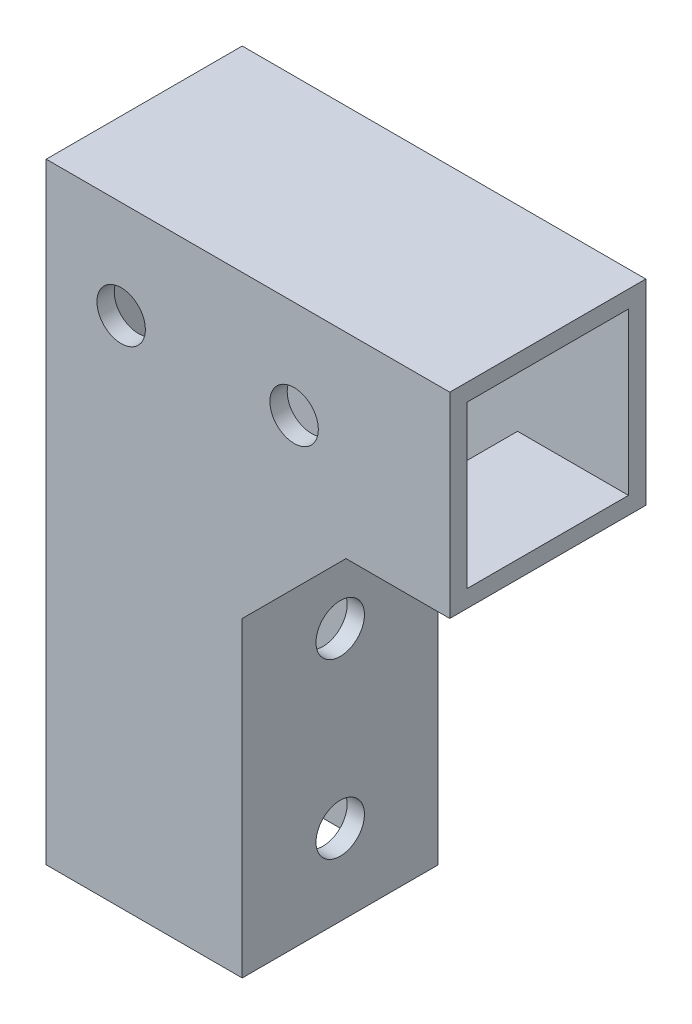
ISO-10303-21;
HEADER;
FILE_DESCRIPTION(('STEP AP214'),'2;1');
FILE_NAME('part.step','',(''),(''),'','','');
FILE_SCHEMA(('AUTOMOTIVE_DESIGN { 1 0 10303 214 1 1 1 1 }'));
ENDSEC;
DATA;
#1=APPLICATION_CONTEXT('core data for automotive mechanical design processes');
#2=APPLICATION_PROTOCOL_DEFINITION('international standard','automotive_design',2000,#1);
#3=PRODUCT_CONTEXT('',#1,'mechanical');
#4=PRODUCT('Part','Part','',(#3));
#5=PRODUCT_RELATED_PRODUCT_CATEGORY('part','',(#4));
#6=PRODUCT_DEFINITION_FORMATION('','',#4);
#7=PRODUCT_DEFINITION_CONTEXT('part definition',#1,'design');
#8=PRODUCT_DEFINITION('design','',#6,#7);
#9=PRODUCT_DEFINITION_SHAPE('','',#8);
#10=(LENGTH_UNIT() NAMED_UNIT(*) SI_UNIT(.MILLI.,.METRE.));
#11=(NAMED_UNIT(*) PLANE_ANGLE_UNIT() SI_UNIT($,.RADIAN.));
#12=(NAMED_UNIT(*) SI_UNIT($,.STERADIAN.) SOLID_ANGLE_UNIT());
#13=UNCERTAINTY_MEASURE_WITH_UNIT(LENGTH_MEASURE(1.E-05),#10,'distance_accuracy_value','');
#14=(GEOMETRIC_REPRESENTATION_CONTEXT(3) GLOBAL_UNCERTAINTY_ASSIGNED_CONTEXT((#13)) GLOBAL_UNIT_ASSIGNED_CONTEXT((#10,
#11,#12)) REPRESENTATION_CONTEXT('',''));
#15=CARTESIAN_POINT('',(0.,0.,0.));
#16=DIRECTION('',(0.,0.,1.));
#17=DIRECTION('',(1.,0.,0.));
#18=AXIS2_PLACEMENT_3D('',#15,#16,#17);
#19=CARTESIAN_POINT('',(-2.,49.,6.));
#20=DIRECTION('',(0.,1.,0.));
#21=DIRECTION('',(0.,0.,1.));
#22=AXIS2_PLACEMENT_3D('',#19,#20,#21);
#23=PLANE('',#22);
#24=DIRECTION('',(-1.,0.,0.));
#25=VECTOR('',#24,1.);
#26=CARTESIAN_POINT('',(-2.,49.,7.95));
#27=LINE('',#26,#25);
#28=CARTESIAN_POINT('',(-1.1,49.,7.95));
#29=VERTEX_POINT('',#28);
#30=CARTESIAN_POINT('',(-2.,49.,7.95));
#31=VERTEX_POINT('',#30);
#32=EDGE_CURVE('E226',#29,#31,#27,.T.);
#33=ORIENTED_EDGE('',*,*,#32,.F.);
#34=DIRECTION('',(0.,0.,1.));
#35=VECTOR('',#34,1.);
#36=CARTESIAN_POINT('',(-1.1,49.,6.9));
#37=LINE('',#36,#35);
#38=CARTESIAN_POINT('',(-1.1,49.,6.9));
#39=VERTEX_POINT('',#38);
#40=EDGE_CURVE('E520',#39,#29,#37,.T.);
#41=ORIENTED_EDGE('',*,*,#40,.F.);
#42=DIRECTION('',(-1.,0.,0.));
#43=VECTOR('',#42,1.);
#44=CARTESIAN_POINT('',(-1.1,49.,6.9));
#45=LINE('',#44,#43);
#46=CARTESIAN_POINT('',(0.,49.,6.9));
#47=VERTEX_POINT('',#46);
#48=EDGE_CURVE('E517',#47,#39,#45,.T.);
#49=ORIENTED_EDGE('',*,*,#48,.F.);
#50=DIRECTION('',(0.,0.,1.));
#51=VECTOR('',#50,1.);
#52=CARTESIAN_POINT('',(0.,49.,6.));
#53=LINE('',#52,#51);
#54=CARTESIAN_POINT('',(0.,49.,6.));
#55=VERTEX_POINT('',#54);
#56=EDGE_CURVE('E257',#55,#47,#53,.T.);
#57=ORIENTED_EDGE('',*,*,#56,.F.);
#58=DIRECTION('',(1.,0.,0.));
#59=VECTOR('',#58,1.);
#60=CARTESIAN_POINT('',(-2.,49.,6.));
#61=LINE('',#60,#59);
#62=CARTESIAN_POINT('',(-2.,49.,6.));
#63=VERTEX_POINT('',#62);
#64=EDGE_CURVE('E252',#63,#55,#61,.T.);
#65=ORIENTED_EDGE('',*,*,#64,.F.);
#66=DIRECTION('',(0.,0.,1.));
#67=VECTOR('',#66,1.);
#68=CARTESIAN_POINT('',(-2.,49.,6.));
#69=LINE('',#68,#67);
#70=EDGE_CURVE('E243',#63,#31,#69,.T.);
#71=ORIENTED_EDGE('',*,*,#70,.T.);
#72=EDGE_LOOP('',(#33,#41,#49,#57,#65,#71));
#73=FACE_BOUND('',#72,.T.);
#74=ADVANCED_FACE('F33',(#73),#23,.T.);
#75=CARTESIAN_POINT('',(15.5,51.5,15.5));
#76=DIRECTION('',(-1.,0.,0.));
#77=DIRECTION('',(0.,0.,1.));
#78=AXIS2_PLACEMENT_3D('',#75,#76,#77);
#79=PLANE('',#78);
#80=CARTESIAN_POINT('',(15.5,22.,8.5));
#81=DIRECTION('',(-1.,0.,0.));
#82=DIRECTION('',(0.,0.,1.));
#83=AXIS2_PLACEMENT_3D('',#80,#81,#82);
#84=CIRCLE('',#83,2.1);
#85=CARTESIAN_POINT('',(15.5,22.,10.6));
#86=VERTEX_POINT('',#85);
#87=EDGE_CURVE('E324',#86,#86,#84,.F.);
#88=ORIENTED_EDGE('',*,*,#87,.T.);
#89=EDGE_LOOP('',(#88));
#90=FACE_BOUND('',#89,.T.);
#91=CARTESIAN_POINT('',(15.5,7.,8.5));
#92=DIRECTION('',(-1.,0.,0.));
#93=DIRECTION('',(0.,0.,1.));
#94=AXIS2_PLACEMENT_3D('',#91,#92,#93);
#95=CIRCLE('',#94,2.1);
#96=CARTESIAN_POINT('',(15.5,7.,10.6));
#97=VERTEX_POINT('',#96);
#98=EDGE_CURVE('E317',#97,#97,#95,.F.);
#99=ORIENTED_EDGE('',*,*,#98,.T.);
#100=EDGE_LOOP('',(#99));
#101=FACE_BOUND('',#100,.T.);
#102=DIRECTION('',(0.,-1.,0.));
#103=VECTOR('',#102,1.);
#104=CARTESIAN_POINT('',(15.5,51.5,15.5));
#105=LINE('',#104,#103);
#106=CARTESIAN_POINT('',(15.5,27.6213203435596,15.5));
#107=VERTEX_POINT('',#106);
#108=CARTESIAN_POINT('',(15.5,0.,15.5));
#109=VERTEX_POINT('',#108);
#110=EDGE_CURVE('E363',#107,#109,#105,.T.);
#111=ORIENTED_EDGE('',*,*,#110,.F.);
#112=DIRECTION('',(0.,0.,-1.));
#113=VECTOR('',#112,1.);
#114=CARTESIAN_POINT('',(15.5,27.6213203435596,15.5));
#115=LINE('',#114,#113);
#116=CARTESIAN_POINT('',(15.5,27.6213203435596,1.5));
#117=VERTEX_POINT('',#116);
#118=EDGE_CURVE('E336',#107,#117,#115,.T.);
#119=ORIENTED_EDGE('',*,*,#118,.T.);
#120=DIRECTION('',(0.,-1.,0.));
#121=VECTOR('',#120,1.);
#122=CARTESIAN_POINT('',(15.5,51.5,1.5));
#123=LINE('',#122,#121);
#124=CARTESIAN_POINT('',(15.5,0.,1.5));
#125=VERTEX_POINT('',#124);
#126=EDGE_CURVE('E361',#117,#125,#123,.T.);
#127=ORIENTED_EDGE('',*,*,#126,.T.);
#128=DIRECTION('',(0.,0.,-1.));
#129=VECTOR('',#128,1.);
#130=CARTESIAN_POINT('',(15.5,0.,15.5));
#131=LINE('',#130,#129);
#132=EDGE_CURVE('E354',#109,#125,#131,.T.);
#133=ORIENTED_EDGE('',*,*,#132,.F.);
#134=EDGE_LOOP('',(#111,#119,#127,#133));
#135=FACE_BOUND('',#134,.T.);
#136=ADVANCED_FACE('F485',(#90,#101,#135),#79,.T.);
#137=CARTESIAN_POINT('',(0.,0.,17.));
#138=DIRECTION('',(0.,1.,0.));
#139=DIRECTION('',(0.,0.,1.));
#140=AXIS2_PLACEMENT_3D('',#137,#138,#139);
#141=PLANE('',#140);
#142=DIRECTION('',(1.,0.,0.));
#143=VECTOR('',#142,1.);
#144=CARTESIAN_POINT('',(0.,0.,0.));
#145=LINE('',#144,#143);
#146=CARTESIAN_POINT('',(0.,0.,0.));
#147=VERTEX_POINT('',#146);
#148=CARTESIAN_POINT('',(17.,0.,0.));
#149=VERTEX_POINT('',#148);
#150=EDGE_CURVE('E388',#147,#149,#145,.T.);
#151=ORIENTED_EDGE('',*,*,#150,.T.);
#152=DIRECTION('',(0.,0.,-1.));
#153=VECTOR('',#152,1.);
#154=CARTESIAN_POINT('',(17.,0.,17.));
#155=LINE('',#154,#153);
#156=CARTESIAN_POINT('',(17.,0.,17.));
#157=VERTEX_POINT('',#156);
#158=EDGE_CURVE('E42',#157,#149,#155,.T.);
#159=ORIENTED_EDGE('',*,*,#158,.F.);
#160=DIRECTION('',(1.,0.,0.));
#161=VECTOR('',#160,1.);
#162=CARTESIAN_POINT('',(0.,0.,17.));
#163=LINE('',#162,#161);
#164=CARTESIAN_POINT('',(0.,0.,17.));
#165=VERTEX_POINT('',#164);
#166=EDGE_CURVE('E372',#165,#157,#163,.T.);
#167=ORIENTED_EDGE('',*,*,#166,.F.);
#168=DIRECTION('',(0.,0.,-1.));
#169=VECTOR('',#168,1.);
#170=CARTESIAN_POINT('',(0.,0.,17.));
#171=LINE('',#170,#169);
#172=EDGE_CURVE('E11',#165,#147,#171,.T.);
#173=ORIENTED_EDGE('',*,*,#172,.T.);
#174=EDGE_LOOP('',(#151,#159,#167,#173));
#175=FACE_BOUND('',#174,.T.);
#176=DIRECTION('',(0.,0.,1.));
#177=VECTOR('',#176,1.);
#178=CARTESIAN_POINT('',(1.5,0.,15.5));
#179=LINE('',#178,#177);
#180=CARTESIAN_POINT('',(1.5,0.,1.5));
#181=VERTEX_POINT('',#180);
#182=CARTESIAN_POINT('',(1.5,0.,15.5));
#183=VERTEX_POINT('',#182);
#184=EDGE_CURVE('E339',#181,#183,#179,.T.);
#185=ORIENTED_EDGE('',*,*,#184,.T.);
#186=DIRECTION('',(1.,0.,0.));
#187=VECTOR('',#186,1.);
#188=CARTESIAN_POINT('',(1.5,0.,15.5));
#189=LINE('',#188,#187);
#190=EDGE_CURVE('E351',#183,#109,#189,.T.);
#191=ORIENTED_EDGE('',*,*,#190,.T.);
#192=ORIENTED_EDGE('',*,*,#132,.T.);
#193=DIRECTION('',(-1.,0.,0.));
#194=VECTOR('',#193,1.);
#195=CARTESIAN_POINT('',(1.5,0.,1.5));
#196=LINE('',#195,#194);
#197=EDGE_CURVE('E344',#125,#181,#196,.T.);
#198=ORIENTED_EDGE('',*,*,#197,.T.);
#199=EDGE_LOOP('',(#185,#191,#192,#198));
#200=FACE_BOUND('',#199,.T.);
#201=ADVANCED_FACE('F471',(#175,#200),#141,.F.);
#202=CARTESIAN_POINT('',(0.,0.,17.));
#203=DIRECTION('',(1.,0.,0.));
#204=DIRECTION('',(0.,0.,-1.));
#205=AXIS2_PLACEMENT_3D('',#202,#203,#204);
#206=PLANE('',#205);
#207=DIRECTION('',(0.,0.,-1.));
#208=VECTOR('',#207,1.);
#209=CARTESIAN_POINT('',(0.,33.,6.));
#210=LINE('',#209,#208);
#211=CARTESIAN_POINT('',(0.,33.,11.));
#212=VERTEX_POINT('',#211);
#213=CARTESIAN_POINT('',(0.,33.,6.));
#214=VERTEX_POINT('',#213);
#215=EDGE_CURVE('E242',#212,#214,#210,.T.);
#216=ORIENTED_EDGE('',*,*,#215,.T.);
#217=DIRECTION('',(0.,1.,0.));
#218=VECTOR('',#217,1.);
#219=CARTESIAN_POINT('',(0.,49.,6.));
#220=LINE('',#219,#218);
#221=EDGE_CURVE('E253',#214,#55,#220,.T.);
#222=ORIENTED_EDGE('',*,*,#221,.T.);
#223=ORIENTED_EDGE('',*,*,#56,.T.);
#224=DIRECTION('',(0.,1.,0.));
#225=VECTOR('',#224,1.);
#226=CARTESIAN_POINT('',(0.,34.,6.9));
#227=LINE('',#226,#225);
#228=CARTESIAN_POINT('',(0.,34.,6.9));
#229=VERTEX_POINT('',#228);
#230=EDGE_CURVE('E534',#229,#47,#227,.T.);
#231=ORIENTED_EDGE('',*,*,#230,.F.);
#232=DIRECTION('',(0.,0.,-1.));
#233=VECTOR('',#232,1.);
#234=CARTESIAN_POINT('',(0.,34.,6.9));
#235=LINE('',#234,#233);
#236=CARTESIAN_POINT('',(0.,34.,10.1));
#237=VERTEX_POINT('',#236);
#238=EDGE_CURVE('E548',#237,#229,#235,.T.);
#239=ORIENTED_EDGE('',*,*,#238,.F.);
#240=DIRECTION('',(0.,1.,0.));
#241=VECTOR('',#240,1.);
#242=CARTESIAN_POINT('',(0.,34.,10.1));
#243=LINE('',#242,#241);
#244=CARTESIAN_POINT('',(0.,49.,10.1));
#245=VERTEX_POINT('',#244);
#246=EDGE_CURVE('E536',#237,#245,#243,.T.);
#247=ORIENTED_EDGE('',*,*,#246,.T.);
#248=CARTESIAN_POINT('',(0.,49.,11.));
#249=VERTEX_POINT('',#248);
#250=EDGE_CURVE('E58',#245,#249,#53,.T.);
#251=ORIENTED_EDGE('',*,*,#250,.T.);
#252=DIRECTION('',(0.,-1.,0.));
#253=VECTOR('',#252,1.);
#254=CARTESIAN_POINT('',(0.,49.,11.));
#255=LINE('',#254,#253);
#256=EDGE_CURVE('E260',#249,#212,#255,.T.);
#257=ORIENTED_EDGE('',*,*,#256,.T.);
#258=EDGE_LOOP('',(#216,#222,#223,#231,#239,#247,#251,#257));
#259=FACE_BOUND('',#258,.T.);
#260=CARTESIAN_POINT('',(0.,22.,8.5));
#261=DIRECTION('',(1.,0.,0.));
#262=DIRECTION('',(0.,0.,-1.));
#263=AXIS2_PLACEMENT_3D('',#260,#261,#262);
#264=CIRCLE('',#263,2.1);
#265=CARTESIAN_POINT('',(0.,22.,6.4));
#266=VERTEX_POINT('',#265);
#267=EDGE_CURVE('E308',#266,#266,#264,.T.);
#268=ORIENTED_EDGE('',*,*,#267,.T.);
#269=EDGE_LOOP('',(#268));
#270=FACE_BOUND('',#269,.T.);
#271=CARTESIAN_POINT('',(0.,7.,8.5));
#272=DIRECTION('',(1.,0.,0.));
#273=DIRECTION('',(0.,0.,-1.));
#274=AXIS2_PLACEMENT_3D('',#271,#272,#273);
#275=CIRCLE('',#274,2.1);
#276=CARTESIAN_POINT('',(0.,7.,6.4));
#277=VERTEX_POINT('',#276);
#278=EDGE_CURVE('E305',#277,#277,#275,.T.);
#279=ORIENTED_EDGE('',*,*,#278,.T.);
#280=EDGE_LOOP('',(#279));
#281=FACE_BOUND('',#280,.T.);
#282=DIRECTION('',(0.,-1.,0.));
#283=VECTOR('',#282,1.);
#284=CARTESIAN_POINT('',(0.,0.,0.));
#285=LINE('',#284,#283);
#286=CARTESIAN_POINT('',(0.,53.,0.));
#287=VERTEX_POINT('',#286);
#288=EDGE_CURVE('E368',#287,#147,#285,.T.);
#289=ORIENTED_EDGE('',*,*,#288,.T.);
#290=ORIENTED_EDGE('',*,*,#172,.F.);
#291=DIRECTION('',(0.,-1.,0.));
#292=VECTOR('',#291,1.);
#293=CARTESIAN_POINT('',(0.,0.,17.));
#294=LINE('',#293,#292);
#295=CARTESIAN_POINT('',(0.,53.,17.));
#296=VERTEX_POINT('',#295);
#297=EDGE_CURVE('E369',#296,#165,#294,.T.);
#298=ORIENTED_EDGE('',*,*,#297,.F.);
#299=DIRECTION('',(0.,0.,-1.));
#300=VECTOR('',#299,1.);
#301=CARTESIAN_POINT('',(0.,53.,17.));
#302=LINE('',#301,#300);
#303=EDGE_CURVE('E385',#296,#287,#302,.T.);
#304=ORIENTED_EDGE('',*,*,#303,.T.);
#305=EDGE_LOOP('',(#289,#290,#298,#304));
#306=FACE_BOUND('',#305,.T.);
#307=ADVANCED_FACE('F35',(#259,#270,#281,#306),#206,.F.);
#308=CARTESIAN_POINT('',(17.,27.,17.));
#309=DIRECTION('',(-1.,0.,0.));
#310=DIRECTION('',(0.,-1.,0.));
#311=AXIS2_PLACEMENT_3D('',#308,#309,#310);
#312=PLANE('',#311);
#313=CARTESIAN_POINT('',(17.,22.,8.5));
#314=DIRECTION('',(-1.,0.,0.));
#315=DIRECTION('',(0.,-1.,0.));
#316=AXIS2_PLACEMENT_3D('',#313,#314,#315);
#317=CIRCLE('',#316,2.1);
#318=CARTESIAN_POINT('',(17.,19.9,8.5));
#319=VERTEX_POINT('',#318);
#320=EDGE_CURVE('E321',#319,#319,#317,.F.);
#321=ORIENTED_EDGE('',*,*,#320,.F.);
#322=EDGE_LOOP('',(#321));
#323=FACE_BOUND('',#322,.T.);
#324=CARTESIAN_POINT('',(17.,7.,8.5));
#325=DIRECTION('',(-1.,0.,0.));
#326=DIRECTION('',(0.,-1.,0.));
#327=AXIS2_PLACEMENT_3D('',#324,#325,#326);
#328=CIRCLE('',#327,2.1);
#329=CARTESIAN_POINT('',(17.,4.9,8.5));
#330=VERTEX_POINT('',#329);
#331=EDGE_CURVE('E314',#330,#330,#328,.F.);
#332=ORIENTED_EDGE('',*,*,#331,.F.);
#333=EDGE_LOOP('',(#332));
#334=FACE_BOUND('',#333,.T.);
#335=DIRECTION('',(0.,1.,0.));
#336=VECTOR('',#335,1.);
#337=CARTESIAN_POINT('',(17.,27.,0.));
#338=LINE('',#337,#336);
#339=CARTESIAN_POINT('',(17.,27.,0.));
#340=VERTEX_POINT('',#339);
#341=EDGE_CURVE('E390',#149,#340,#338,.T.);
#342=ORIENTED_EDGE('',*,*,#341,.T.);
#343=DIRECTION('',(0.,0.,-1.));
#344=VECTOR('',#343,1.);
#345=CARTESIAN_POINT('',(17.,27.,17.));
#346=LINE('',#345,#344);
#347=CARTESIAN_POINT('',(17.,27.,17.));
#348=VERTEX_POINT('',#347);
#349=EDGE_CURVE('E410',#348,#340,#346,.T.);
#350=ORIENTED_EDGE('',*,*,#349,.F.);
#351=DIRECTION('',(0.,1.,0.));
#352=VECTOR('',#351,1.);
#353=CARTESIAN_POINT('',(17.,27.,17.));
#354=LINE('',#353,#352);
#355=EDGE_CURVE('E375',#157,#348,#354,.T.);
#356=ORIENTED_EDGE('',*,*,#355,.F.);
#357=ORIENTED_EDGE('',*,*,#158,.T.);
#358=EDGE_LOOP('',(#342,#350,#356,#357));
#359=FACE_BOUND('',#358,.T.);
#360=ADVANCED_FACE('F468',(#323,#334,#359),#312,.F.);
#361=CARTESIAN_POINT('',(17.,27.,17.));
#362=DIRECTION('',(-0.707106781186548,0.707106781186548,0.));
#363=DIRECTION('',(-0.707106781186548,-0.707106781186548,0.));
#364=AXIS2_PLACEMENT_3D('',#361,#362,#363);
#365=PLANE('',#364);
#366=DIRECTION('',(0.707106781186547,0.707106781186547,0.));
#367=VECTOR('',#366,1.);
#368=CARTESIAN_POINT('',(17.,27.,0.));
#369=LINE('',#368,#367);
#370=CARTESIAN_POINT('',(26.,36.,0.));
#371=VERTEX_POINT('',#370);
#372=EDGE_CURVE('E392',#340,#371,#369,.T.);
#373=ORIENTED_EDGE('',*,*,#372,.T.);
#374=DIRECTION('',(0.,0.,-1.));
#375=VECTOR('',#374,1.);
#376=CARTESIAN_POINT('',(26.,36.,17.));
#377=LINE('',#376,#375);
#378=CARTESIAN_POINT('',(26.,36.,17.));
#379=VERTEX_POINT('',#378);
#380=EDGE_CURVE('E407',#379,#371,#377,.T.);
#381=ORIENTED_EDGE('',*,*,#380,.F.);
#382=DIRECTION('',(0.707106781186547,0.707106781186547,0.));
#383=VECTOR('',#382,1.);
#384=CARTESIAN_POINT('',(17.,27.,17.));
#385=LINE('',#384,#383);
#386=EDGE_CURVE('E377',#348,#379,#385,.T.);
#387=ORIENTED_EDGE('',*,*,#386,.F.);
#388=ORIENTED_EDGE('',*,*,#349,.T.);
#389=EDGE_LOOP('',(#373,#381,#387,#388));
#390=FACE_BOUND('',#389,.T.);
#391=ADVANCED_FACE('F464',(#390),#365,.F.);
#392=CARTESIAN_POINT('',(26.,36.,17.));
#393=DIRECTION('',(0.,1.,0.));
#394=DIRECTION('',(0.,0.,1.));
#395=AXIS2_PLACEMENT_3D('',#392,#393,#394);
#396=PLANE('',#395);
#397=DIRECTION('',(1.,0.,0.));
#398=VECTOR('',#397,1.);
#399=CARTESIAN_POINT('',(26.,36.,0.));
#400=LINE('',#399,#398);
#401=CARTESIAN_POINT('',(35.,36.,0.));
#402=VERTEX_POINT('',#401);
#403=EDGE_CURVE('E394',#371,#402,#400,.T.);
#404=ORIENTED_EDGE('',*,*,#403,.T.);
#405=DIRECTION('',(0.,0.,-1.));
#406=VECTOR('',#405,1.);
#407=CARTESIAN_POINT('',(35.,36.,17.));
#408=LINE('',#407,#406);
#409=CARTESIAN_POINT('',(35.,36.,17.));
#410=VERTEX_POINT('',#409);
#411=EDGE_CURVE('E404',#410,#402,#408,.T.);
#412=ORIENTED_EDGE('',*,*,#411,.F.);
#413=DIRECTION('',(1.,0.,0.));
#414=VECTOR('',#413,1.);
#415=CARTESIAN_POINT('',(26.,36.,17.));
#416=LINE('',#415,#414);
#417=EDGE_CURVE('E379',#379,#410,#416,.T.);
#418=ORIENTED_EDGE('',*,*,#417,.F.);
#419=ORIENTED_EDGE('',*,*,#380,.T.);
#420=EDGE_LOOP('',(#404,#412,#418,#419));
#421=FACE_BOUND('',#420,.T.);
#422=ADVANCED_FACE('F459',(#421),#396,.F.);
#423=CARTESIAN_POINT('',(35.,53.,17.));
#424=DIRECTION('',(-1.,0.,0.));
#425=DIRECTION('',(0.,-1.,0.));
#426=AXIS2_PLACEMENT_3D('',#423,#424,#425);
#427=PLANE('',#426);
#428=DIRECTION('',(0.,0.,-1.));
#429=VECTOR('',#428,1.);
#430=CARTESIAN_POINT('',(35.,37.5,15.5));
#431=LINE('',#430,#429);
#432=CARTESIAN_POINT('',(35.,37.5,15.5));
#433=VERTEX_POINT('',#432);
#434=CARTESIAN_POINT('',(35.,37.5,1.5));
#435=VERTEX_POINT('',#434);
#436=EDGE_CURVE('E293',#433,#435,#431,.T.);
#437=ORIENTED_EDGE('',*,*,#436,.F.);
#438=DIRECTION('',(0.,-1.,0.));
#439=VECTOR('',#438,1.);
#440=CARTESIAN_POINT('',(35.,51.5,15.5));
#441=LINE('',#440,#439);
#442=CARTESIAN_POINT('',(35.,51.5,15.5));
#443=VERTEX_POINT('',#442);
#444=EDGE_CURVE('E291',#443,#433,#441,.T.);
#445=ORIENTED_EDGE('',*,*,#444,.F.);
#446=DIRECTION('',(0.,0.,1.));
#447=VECTOR('',#446,1.);
#448=CARTESIAN_POINT('',(35.,51.5,15.5));
#449=LINE('',#448,#447);
#450=CARTESIAN_POINT('',(35.,51.5,1.5));
#451=VERTEX_POINT('',#450);
#452=EDGE_CURVE('E299',#451,#443,#449,.T.);
#453=ORIENTED_EDGE('',*,*,#452,.F.);
#454=DIRECTION('',(0.,1.,0.));
#455=VECTOR('',#454,1.);
#456=CARTESIAN_POINT('',(35.,51.5,1.5));
#457=LINE('',#456,#455);
#458=EDGE_CURVE('E296',#435,#451,#457,.T.);
#459=ORIENTED_EDGE('',*,*,#458,.F.);
#460=EDGE_LOOP('',(#437,#445,#453,#459));
#461=FACE_BOUND('',#460,.T.);
#462=DIRECTION('',(0.,1.,0.));
#463=VECTOR('',#462,1.);
#464=CARTESIAN_POINT('',(35.,53.,0.));
#465=LINE('',#464,#463);
#466=CARTESIAN_POINT('',(35.,53.,0.));
#467=VERTEX_POINT('',#466);
#468=EDGE_CURVE('E396',#402,#467,#465,.T.);
#469=ORIENTED_EDGE('',*,*,#468,.T.);
#470=DIRECTION('',(0.,0.,-1.));
#471=VECTOR('',#470,1.);
#472=CARTESIAN_POINT('',(35.,53.,17.));
#473=LINE('',#472,#471);
#474=CARTESIAN_POINT('',(35.,53.,17.));
#475=VERTEX_POINT('',#474);
#476=EDGE_CURVE('E401',#475,#467,#473,.T.);
#477=ORIENTED_EDGE('',*,*,#476,.F.);
#478=DIRECTION('',(0.,1.,0.));
#479=VECTOR('',#478,1.);
#480=CARTESIAN_POINT('',(35.,53.,17.));
#481=LINE('',#480,#479);
#482=EDGE_CURVE('E381',#410,#475,#481,.T.);
#483=ORIENTED_EDGE('',*,*,#482,.F.);
#484=ORIENTED_EDGE('',*,*,#411,.T.);
#485=EDGE_LOOP('',(#469,#477,#483,#484));
#486=FACE_BOUND('',#485,.T.);
#487=ADVANCED_FACE('F454',(#461,#486),#427,.F.);
#488=CARTESIAN_POINT('',(0.,53.,17.));
#489=DIRECTION('',(0.,-1.,0.));
#490=DIRECTION('',(0.,0.,-1.));
#491=AXIS2_PLACEMENT_3D('',#488,#489,#490);
#492=PLANE('',#491);
#493=DIRECTION('',(-1.,0.,0.));
#494=VECTOR('',#493,1.);
#495=CARTESIAN_POINT('',(0.,53.,0.));
#496=LINE('',#495,#494);
#497=EDGE_CURVE('E373',#467,#287,#496,.T.);
#498=ORIENTED_EDGE('',*,*,#497,.T.);
#499=ORIENTED_EDGE('',*,*,#303,.F.);
#500=DIRECTION('',(-1.,0.,0.));
#501=VECTOR('',#500,1.);
#502=CARTESIAN_POINT('',(0.,53.,17.));
#503=LINE('',#502,#501);
#504=EDGE_CURVE('E383',#475,#296,#503,.T.);
#505=ORIENTED_EDGE('',*,*,#504,.F.);
#506=ORIENTED_EDGE('',*,*,#476,.T.);
#507=EDGE_LOOP('',(#498,#499,#505,#506));
#508=FACE_BOUND('',#507,.T.);
#509=ADVANCED_FACE('F450',(#508),#492,.F.);
#510=CARTESIAN_POINT('',(0.,0.,17.));
#511=DIRECTION('',(0.,0.,-1.));
#512=DIRECTION('',(-1.,0.,0.));
#513=AXIS2_PLACEMENT_3D('',#510,#511,#512);
#514=PLANE('',#513);
#515=CARTESIAN_POINT('',(6.49999999999999,44.5,17.));
#516=DIRECTION('',(0.,0.,1.));
#517=DIRECTION('',(1.,0.,0.));
#518=AXIS2_PLACEMENT_3D('',#515,#516,#517);
#519=CIRCLE('',#518,2.1);
#520=CARTESIAN_POINT('',(8.59999999999999,44.5,17.));
#521=VERTEX_POINT('',#520);
#522=EDGE_CURVE('E273',#521,#521,#519,.T.);
#523=ORIENTED_EDGE('',*,*,#522,.F.);
#524=EDGE_LOOP('',(#523));
#525=FACE_BOUND('',#524,.T.);
#526=CARTESIAN_POINT('',(21.5,44.5,17.));
#527=DIRECTION('',(0.,0.,1.));
#528=DIRECTION('',(1.,0.,0.));
#529=AXIS2_PLACEMENT_3D('',#526,#527,#528);
#530=CIRCLE('',#529,2.1);
#531=CARTESIAN_POINT('',(23.6,44.5,17.));
#532=VERTEX_POINT('',#531);
#533=EDGE_CURVE('E280',#532,#532,#530,.T.);
#534=ORIENTED_EDGE('',*,*,#533,.F.);
#535=EDGE_LOOP('',(#534));
#536=FACE_BOUND('',#535,.T.);
#537=ORIENTED_EDGE('',*,*,#297,.T.);
#538=ORIENTED_EDGE('',*,*,#166,.T.);
#539=ORIENTED_EDGE('',*,*,#355,.T.);
#540=ORIENTED_EDGE('',*,*,#386,.T.);
#541=ORIENTED_EDGE('',*,*,#417,.T.);
#542=ORIENTED_EDGE('',*,*,#482,.T.);
#543=ORIENTED_EDGE('',*,*,#504,.T.);
#544=EDGE_LOOP('',(#537,#538,#539,#540,#541,#542,#543));
#545=FACE_BOUND('',#544,.T.);
#546=ADVANCED_FACE('F437',(#525,#536,#545),#514,.F.);
#547=CARTESIAN_POINT('',(0.,0.,0.));
#548=DIRECTION('',(0.,0.,-1.));
#549=DIRECTION('',(-1.,0.,0.));
#550=AXIS2_PLACEMENT_3D('',#547,#548,#549);
#551=PLANE('',#550);
#552=CARTESIAN_POINT('',(6.49999999999999,44.5,0.));
#553=DIRECTION('',(0.,0.,1.));
#554=DIRECTION('',(1.,0.,0.));
#555=AXIS2_PLACEMENT_3D('',#552,#553,#554);
#556=CIRCLE('',#555,2.1);
#557=CARTESIAN_POINT('',(8.59999999999999,44.5,0.));
#558=VERTEX_POINT('',#557);
#559=EDGE_CURVE('E277',#558,#558,#556,.T.);
#560=ORIENTED_EDGE('',*,*,#559,.T.);
#561=EDGE_LOOP('',(#560));
#562=FACE_BOUND('',#561,.T.);
#563=CARTESIAN_POINT('',(21.5,44.5,0.));
#564=DIRECTION('',(0.,0.,1.));
#565=DIRECTION('',(1.,0.,0.));
#566=AXIS2_PLACEMENT_3D('',#563,#564,#565);
#567=CIRCLE('',#566,2.1);
#568=CARTESIAN_POINT('',(23.6,44.5,0.));
#569=VERTEX_POINT('',#568);
#570=EDGE_CURVE('E266',#569,#569,#567,.T.);
#571=ORIENTED_EDGE('',*,*,#570,.T.);
#572=EDGE_LOOP('',(#571));
#573=FACE_BOUND('',#572,.T.);
#574=ORIENTED_EDGE('',*,*,#288,.F.);
#575=ORIENTED_EDGE('',*,*,#497,.F.);
#576=ORIENTED_EDGE('',*,*,#468,.F.);
#577=ORIENTED_EDGE('',*,*,#403,.F.);
#578=ORIENTED_EDGE('',*,*,#372,.F.);
#579=ORIENTED_EDGE('',*,*,#341,.F.);
#580=ORIENTED_EDGE('',*,*,#150,.F.);
#581=EDGE_LOOP('',(#574,#575,#576,#577,#578,#579,#580));
#582=FACE_BOUND('',#581,.T.);
#583=ADVANCED_FACE('F433',(#562,#573,#582),#551,.T.);
#584=CARTESIAN_POINT('',(1.5,51.5,15.5));
#585=DIRECTION('',(1.,0.,0.));
#586=DIRECTION('',(0.,0.,-1.));
#587=AXIS2_PLACEMENT_3D('',#584,#585,#586);
#588=PLANE('',#587);
#589=CARTESIAN_POINT('',(1.5,22.,8.5));
#590=DIRECTION('',(1.,0.,0.));
#591=DIRECTION('',(0.,0.,-1.));
#592=AXIS2_PLACEMENT_3D('',#589,#590,#591);
#593=CIRCLE('',#592,2.1);
#594=CARTESIAN_POINT('',(1.5,22.,6.4));
#595=VERTEX_POINT('',#594);
#596=EDGE_CURVE('E320',#595,#595,#593,.F.);
#597=ORIENTED_EDGE('',*,*,#596,.T.);
#598=EDGE_LOOP('',(#597));
#599=FACE_BOUND('',#598,.T.);
#600=CARTESIAN_POINT('',(1.5,7.,8.5));
#601=DIRECTION('',(1.,0.,0.));
#602=DIRECTION('',(0.,0.,-1.));
#603=AXIS2_PLACEMENT_3D('',#600,#601,#602);
#604=CIRCLE('',#603,2.1);
#605=CARTESIAN_POINT('',(1.5,7.,6.4));
#606=VERTEX_POINT('',#605);
#607=EDGE_CURVE('E311',#606,#606,#604,.F.);
#608=ORIENTED_EDGE('',*,*,#607,.T.);
#609=EDGE_LOOP('',(#608));
#610=FACE_BOUND('',#609,.T.);
#611=ORIENTED_EDGE('',*,*,#184,.F.);
#612=DIRECTION('',(0.,-1.,0.));
#613=VECTOR('',#612,1.);
#614=CARTESIAN_POINT('',(1.5,51.5,1.5));
#615=LINE('',#614,#613);
#616=CARTESIAN_POINT('',(1.5,51.5,1.5));
#617=VERTEX_POINT('',#616);
#618=EDGE_CURVE('E348',#617,#181,#615,.T.);
#619=ORIENTED_EDGE('',*,*,#618,.F.);
#620=DIRECTION('',(0.,0.,1.));
#621=VECTOR('',#620,1.);
#622=CARTESIAN_POINT('',(1.5,51.5,15.5));
#623=LINE('',#622,#621);
#624=CARTESIAN_POINT('',(1.5,51.5,15.5));
#625=VERTEX_POINT('',#624);
#626=EDGE_CURVE('E340',#617,#625,#623,.T.);
#627=ORIENTED_EDGE('',*,*,#626,.T.);
#628=DIRECTION('',(0.,-1.,0.));
#629=VECTOR('',#628,1.);
#630=CARTESIAN_POINT('',(1.5,51.5,15.5));
#631=LINE('',#630,#629);
#632=EDGE_CURVE('E365',#625,#183,#631,.T.);
#633=ORIENTED_EDGE('',*,*,#632,.T.);
#634=EDGE_LOOP('',(#611,#619,#627,#633));
#635=FACE_BOUND('',#634,.T.);
#636=ADVANCED_FACE('F436',(#599,#610,#635),#588,.T.);
#637=CARTESIAN_POINT('',(1.5,51.5,15.5));
#638=DIRECTION('',(0.,0.,-1.));
#639=DIRECTION('',(-1.,0.,0.));
#640=AXIS2_PLACEMENT_3D('',#637,#638,#639);
#641=PLANE('',#640);
#642=CARTESIAN_POINT('',(6.49999999999999,44.5,15.5));
#643=DIRECTION('',(0.,0.,-1.));
#644=DIRECTION('',(-1.,0.,0.));
#645=AXIS2_PLACEMENT_3D('',#642,#643,#644);
#646=CIRCLE('',#645,2.1);
#647=CARTESIAN_POINT('',(4.4,44.5,15.5));
#648=VERTEX_POINT('',#647);
#649=EDGE_CURVE('E288',#648,#648,#646,.F.);
#650=ORIENTED_EDGE('',*,*,#649,.T.);
#651=EDGE_LOOP('',(#650));
#652=FACE_BOUND('',#651,.T.);
#653=CARTESIAN_POINT('',(21.5,44.5,15.5));
#654=DIRECTION('',(0.,0.,-1.));
#655=DIRECTION('',(-1.,0.,0.));
#656=AXIS2_PLACEMENT_3D('',#653,#654,#655);
#657=CIRCLE('',#656,2.1);
#658=CARTESIAN_POINT('',(19.4,44.5,15.5));
#659=VERTEX_POINT('',#658);
#660=EDGE_CURVE('E285',#659,#659,#657,.F.);
#661=ORIENTED_EDGE('',*,*,#660,.T.);
#662=EDGE_LOOP('',(#661));
#663=FACE_BOUND('',#662,.T.);
#664=DIRECTION('',(1.,0.,0.));
#665=VECTOR('',#664,1.);
#666=CARTESIAN_POINT('',(1.5,51.5,15.5));
#667=LINE('',#666,#665);
#668=EDGE_CURVE('E343',#625,#443,#667,.T.);
#669=ORIENTED_EDGE('',*,*,#668,.T.);
#670=ORIENTED_EDGE('',*,*,#444,.T.);
#671=DIRECTION('',(1.,0.,0.));
#672=VECTOR('',#671,1.);
#673=CARTESIAN_POINT('',(8.,37.5,15.5));
#674=LINE('',#673,#672);
#675=CARTESIAN_POINT('',(25.3786796564404,37.5,15.5));
#676=VERTEX_POINT('',#675);
#677=EDGE_CURVE('E302',#676,#433,#674,.T.);
#678=ORIENTED_EDGE('',*,*,#677,.F.);
#679=DIRECTION('',(0.707106781186547,0.707106781186548,0.));
#680=VECTOR('',#679,1.);
#681=CARTESIAN_POINT('',(25.3786796564404,37.5,15.5));
#682=LINE('',#681,#680);
#683=EDGE_CURVE('E328',#107,#676,#682,.T.);
#684=ORIENTED_EDGE('',*,*,#683,.F.);
#685=ORIENTED_EDGE('',*,*,#110,.T.);
#686=ORIENTED_EDGE('',*,*,#190,.F.);
#687=ORIENTED_EDGE('',*,*,#632,.F.);
#688=EDGE_LOOP('',(#669,#670,#678,#684,#685,#686,#687));
#689=FACE_BOUND('',#688,.T.);
#690=ADVANCED_FACE('F696',(#652,#663,#689),#641,.T.);
#691=CARTESIAN_POINT('',(1.5,51.5,1.5));
#692=DIRECTION('',(0.,0.,1.));
#693=DIRECTION('',(1.,0.,0.));
#694=AXIS2_PLACEMENT_3D('',#691,#692,#693);
#695=PLANE('',#694);
#696=CARTESIAN_POINT('',(6.49999999999999,44.5,1.5));
#697=DIRECTION('',(0.,0.,1.));
#698=DIRECTION('',(1.,0.,0.));
#699=AXIS2_PLACEMENT_3D('',#696,#697,#698);
#700=CIRCLE('',#699,2.1);
#701=CARTESIAN_POINT('',(8.59999999999999,44.5,1.5));
#702=VERTEX_POINT('',#701);
#703=EDGE_CURVE('E37',#702,#702,#700,.F.);
#704=ORIENTED_EDGE('',*,*,#703,.T.);
#705=EDGE_LOOP('',(#704));
#706=FACE_BOUND('',#705,.T.);
#707=CARTESIAN_POINT('',(21.5,44.5,1.5));
#708=DIRECTION('',(0.,0.,1.));
#709=DIRECTION('',(1.,0.,0.));
#710=AXIS2_PLACEMENT_3D('',#707,#708,#709);
#711=CIRCLE('',#710,2.1);
#712=CARTESIAN_POINT('',(23.6,44.5,1.5));
#713=VERTEX_POINT('',#712);
#714=EDGE_CURVE('E276',#713,#713,#711,.F.);
#715=ORIENTED_EDGE('',*,*,#714,.T.);
#716=EDGE_LOOP('',(#715));
#717=FACE_BOUND('',#716,.T.);
#718=ORIENTED_EDGE('',*,*,#458,.T.);
#719=DIRECTION('',(-1.,0.,0.));
#720=VECTOR('',#719,1.);
#721=CARTESIAN_POINT('',(1.5,51.5,1.5));
#722=LINE('',#721,#720);
#723=EDGE_CURVE('E346',#451,#617,#722,.T.);
#724=ORIENTED_EDGE('',*,*,#723,.T.);
#725=ORIENTED_EDGE('',*,*,#618,.T.);
#726=ORIENTED_EDGE('',*,*,#197,.F.);
#727=ORIENTED_EDGE('',*,*,#126,.F.);
#728=DIRECTION('',(0.707106781186547,0.707106781186548,0.));
#729=VECTOR('',#728,1.);
#730=CARTESIAN_POINT('',(25.3786796564404,37.5,1.5));
#731=LINE('',#730,#729);
#732=CARTESIAN_POINT('',(25.3786796564404,37.5,1.5));
#733=VERTEX_POINT('',#732);
#734=EDGE_CURVE('E327',#117,#733,#731,.T.);
#735=ORIENTED_EDGE('',*,*,#734,.T.);
#736=DIRECTION('',(1.,0.,0.));
#737=VECTOR('',#736,1.);
#738=CARTESIAN_POINT('',(8.,37.5,1.5));
#739=LINE('',#738,#737);
#740=EDGE_CURVE('E303',#733,#435,#739,.T.);
#741=ORIENTED_EDGE('',*,*,#740,.T.);
#742=EDGE_LOOP('',(#718,#724,#725,#726,#727,#735,#741));
#743=FACE_BOUND('',#742,.T.);
#744=ADVANCED_FACE('F421',(#706,#717,#743),#695,.T.);
#745=CARTESIAN_POINT('',(0.,51.5,0.));
#746=DIRECTION('',(0.,-1.,0.));
#747=DIRECTION('',(0.,0.,-1.));
#748=AXIS2_PLACEMENT_3D('',#745,#746,#747);
#749=PLANE('',#748);
#750=ORIENTED_EDGE('',*,*,#452,.T.);
#751=ORIENTED_EDGE('',*,*,#668,.F.);
#752=ORIENTED_EDGE('',*,*,#626,.F.);
#753=ORIENTED_EDGE('',*,*,#723,.F.);
#754=EDGE_LOOP('',(#750,#751,#752,#753));
#755=FACE_BOUND('',#754,.T.);
#756=ADVANCED_FACE('F695',(#755),#749,.T.);
#757=CARTESIAN_POINT('',(25.3786796564404,37.5,15.5));
#758=DIRECTION('',(-0.707106781186548,0.707106781186547,0.));
#759=DIRECTION('',(-0.707106781186547,-0.707106781186548,0.));
#760=AXIS2_PLACEMENT_3D('',#757,#758,#759);
#761=PLANE('',#760);
#762=ORIENTED_EDGE('',*,*,#734,.F.);
#763=ORIENTED_EDGE('',*,*,#118,.F.);
#764=ORIENTED_EDGE('',*,*,#683,.T.);
#765=DIRECTION('',(0.,0.,-1.));
#766=VECTOR('',#765,1.);
#767=CARTESIAN_POINT('',(25.3786796564404,37.5,15.5));
#768=LINE('',#767,#766);
#769=EDGE_CURVE('E331',#676,#733,#768,.T.);
#770=ORIENTED_EDGE('',*,*,#769,.T.);
#771=EDGE_LOOP('',(#762,#763,#764,#770));
#772=FACE_BOUND('',#771,.T.);
#773=ADVANCED_FACE('F738',(#772),#761,.T.);
#774=CARTESIAN_POINT('',(35.,7.,8.5));
#775=DIRECTION('',(-1.,0.,0.));
#776=DIRECTION('',(0.,0.,1.));
#777=AXIS2_PLACEMENT_3D('',#774,#775,#776);
#778=CYLINDRICAL_SURFACE('',#777,2.1);
#779=ORIENTED_EDGE('',*,*,#607,.F.);
#780=EDGE_LOOP('',(#779));
#781=FACE_BOUND('',#780,.T.);
#782=ORIENTED_EDGE('',*,*,#278,.F.);
#783=EDGE_LOOP('',(#782));
#784=FACE_BOUND('',#783,.T.);
#785=ADVANCED_FACE('F743',(#781,#784),#778,.F.);
#786=CARTESIAN_POINT('',(35.,22.,8.5));
#787=DIRECTION('',(-1.,0.,0.));
#788=DIRECTION('',(0.,0.,1.));
#789=AXIS2_PLACEMENT_3D('',#786,#787,#788);
#790=CYLINDRICAL_SURFACE('',#789,2.1);
#791=ORIENTED_EDGE('',*,*,#596,.F.);
#792=EDGE_LOOP('',(#791));
#793=FACE_BOUND('',#792,.T.);
#794=ORIENTED_EDGE('',*,*,#267,.F.);
#795=EDGE_LOOP('',(#794));
#796=FACE_BOUND('',#795,.T.);
#797=ADVANCED_FACE('F775',(#793,#796),#790,.F.);
#798=ORIENTED_EDGE('',*,*,#98,.F.);
#799=EDGE_LOOP('',(#798));
#800=FACE_BOUND('',#799,.T.);
#801=ORIENTED_EDGE('',*,*,#331,.T.);
#802=EDGE_LOOP('',(#801));
#803=FACE_BOUND('',#802,.T.);
#804=ADVANCED_FACE('F772',(#800,#803),#778,.F.);
#805=ORIENTED_EDGE('',*,*,#87,.F.);
#806=EDGE_LOOP('',(#805));
#807=FACE_BOUND('',#806,.T.);
#808=ORIENTED_EDGE('',*,*,#320,.T.);
#809=EDGE_LOOP('',(#808));
#810=FACE_BOUND('',#809,.T.);
#811=ADVANCED_FACE('F731',(#807,#810),#790,.F.);
#812=CARTESIAN_POINT('',(8.,37.5,15.5));
#813=DIRECTION('',(0.,-1.,0.));
#814=DIRECTION('',(1.,0.,0.));
#815=AXIS2_PLACEMENT_3D('',#812,#813,#814);
#816=PLANE('',#815);
#817=ORIENTED_EDGE('',*,*,#769,.F.);
#818=ORIENTED_EDGE('',*,*,#677,.T.);
#819=ORIENTED_EDGE('',*,*,#436,.T.);
#820=ORIENTED_EDGE('',*,*,#740,.F.);
#821=EDGE_LOOP('',(#817,#818,#819,#820));
#822=FACE_BOUND('',#821,.T.);
#823=ADVANCED_FACE('F428',(#822),#816,.F.);
#824=CARTESIAN_POINT('',(21.5,44.5,17.));
#825=DIRECTION('',(0.,0.,-1.));
#826=DIRECTION('',(-1.,0.,0.));
#827=AXIS2_PLACEMENT_3D('',#824,#825,#826);
#828=CYLINDRICAL_SURFACE('',#827,2.1);
#829=ORIENTED_EDGE('',*,*,#714,.F.);
#830=EDGE_LOOP('',(#829));
#831=FACE_BOUND('',#830,.T.);
#832=ORIENTED_EDGE('',*,*,#570,.F.);
#833=EDGE_LOOP('',(#832));
#834=FACE_BOUND('',#833,.T.);
#835=ADVANCED_FACE('F424',(#831,#834),#828,.F.);
#836=CARTESIAN_POINT('',(6.49999999999999,44.5,17.));
#837=DIRECTION('',(0.,0.,-1.));
#838=DIRECTION('',(-1.,0.,0.));
#839=AXIS2_PLACEMENT_3D('',#836,#837,#838);
#840=CYLINDRICAL_SURFACE('',#839,2.1);
#841=ORIENTED_EDGE('',*,*,#703,.F.);
#842=EDGE_LOOP('',(#841));
#843=FACE_BOUND('',#842,.T.);
#844=ORIENTED_EDGE('',*,*,#559,.F.);
#845=EDGE_LOOP('',(#844));
#846=FACE_BOUND('',#845,.T.);
#847=ADVANCED_FACE('F427',(#843,#846),#840,.F.);
#848=ORIENTED_EDGE('',*,*,#660,.F.);
#849=EDGE_LOOP('',(#848));
#850=FACE_BOUND('',#849,.T.);
#851=ORIENTED_EDGE('',*,*,#533,.T.);
#852=EDGE_LOOP('',(#851));
#853=FACE_BOUND('',#852,.T.);
#854=ADVANCED_FACE('F430',(#850,#853),#828,.F.);
#855=ORIENTED_EDGE('',*,*,#649,.F.);
#856=EDGE_LOOP('',(#855));
#857=FACE_BOUND('',#856,.T.);
#858=ORIENTED_EDGE('',*,*,#522,.T.);
#859=EDGE_LOOP('',(#858));
#860=FACE_BOUND('',#859,.T.);
#861=ADVANCED_FACE('F578',(#857,#860),#840,.F.);
#862=CARTESIAN_POINT('',(-2.,49.,6.));
#863=DIRECTION('',(0.,0.,-1.));
#864=DIRECTION('',(-1.,0.,0.));
#865=AXIS2_PLACEMENT_3D('',#862,#863,#864);
#866=PLANE('',#865);
#867=ORIENTED_EDGE('',*,*,#221,.F.);
#868=DIRECTION('',(1.,0.,0.));
#869=VECTOR('',#868,1.);
#870=CARTESIAN_POINT('',(-2.,33.,6.));
#871=LINE('',#870,#869);
#872=CARTESIAN_POINT('',(-2.,33.,6.));
#873=VERTEX_POINT('',#872);
#874=EDGE_CURVE('E264',#873,#214,#871,.T.);
#875=ORIENTED_EDGE('',*,*,#874,.F.);
#876=DIRECTION('',(0.,1.,0.));
#877=VECTOR('',#876,1.);
#878=CARTESIAN_POINT('',(-2.,49.,6.));
#879=LINE('',#878,#877);
#880=EDGE_CURVE('E239',#873,#63,#879,.T.);
#881=ORIENTED_EDGE('',*,*,#880,.T.);
#882=ORIENTED_EDGE('',*,*,#64,.T.);
#883=EDGE_LOOP('',(#867,#875,#881,#882));
#884=FACE_BOUND('',#883,.T.);
#885=ADVANCED_FACE('F568',(#884),#866,.T.);
#886=CARTESIAN_POINT('',(-2.,33.,6.));
#887=DIRECTION('',(0.,-1.,0.));
#888=DIRECTION('',(0.,0.,-1.));
#889=AXIS2_PLACEMENT_3D('',#886,#887,#888);
#890=PLANE('',#889);
#891=ORIENTED_EDGE('',*,*,#215,.F.);
#892=DIRECTION('',(1.,0.,0.));
#893=VECTOR('',#892,1.);
#894=CARTESIAN_POINT('',(-2.,33.,11.));
#895=LINE('',#894,#893);
#896=CARTESIAN_POINT('',(-2.,33.,11.));
#897=VERTEX_POINT('',#896);
#898=EDGE_CURVE('E267',#897,#212,#895,.T.);
#899=ORIENTED_EDGE('',*,*,#898,.F.);
#900=DIRECTION('',(0.,0.,-1.));
#901=VECTOR('',#900,1.);
#902=CARTESIAN_POINT('',(-2.,33.,6.));
#903=LINE('',#902,#901);
#904=EDGE_CURVE('E249',#897,#873,#903,.T.);
#905=ORIENTED_EDGE('',*,*,#904,.T.);
#906=ORIENTED_EDGE('',*,*,#874,.T.);
#907=EDGE_LOOP('',(#891,#899,#905,#906));
#908=FACE_BOUND('',#907,.T.);
#909=ADVANCED_FACE('F508',(#908),#890,.T.);
#910=CARTESIAN_POINT('',(-2.,49.,11.));
#911=DIRECTION('',(0.,0.,1.));
#912=DIRECTION('',(1.,0.,0.));
#913=AXIS2_PLACEMENT_3D('',#910,#911,#912);
#914=PLANE('',#913);
#915=ORIENTED_EDGE('',*,*,#256,.F.);
#916=DIRECTION('',(1.,0.,0.));
#917=VECTOR('',#916,1.);
#918=CARTESIAN_POINT('',(-2.,49.,11.));
#919=LINE('',#918,#917);
#920=CARTESIAN_POINT('',(-2.,49.,11.));
#921=VERTEX_POINT('',#920);
#922=EDGE_CURVE('E269',#921,#249,#919,.T.);
#923=ORIENTED_EDGE('',*,*,#922,.F.);
#924=DIRECTION('',(0.,-1.,0.));
#925=VECTOR('',#924,1.);
#926=CARTESIAN_POINT('',(-2.,49.,11.));
#927=LINE('',#926,#925);
#928=EDGE_CURVE('E246',#921,#897,#927,.T.);
#929=ORIENTED_EDGE('',*,*,#928,.T.);
#930=ORIENTED_EDGE('',*,*,#898,.T.);
#931=EDGE_LOOP('',(#915,#923,#929,#930));
#932=FACE_BOUND('',#931,.T.);
#933=ADVANCED_FACE('F500',(#932),#914,.T.);
#934=DIRECTION('',(1.,0.,0.));
#935=VECTOR('',#934,1.);
#936=CARTESIAN_POINT('',(-1.1,49.,10.1));
#937=LINE('',#936,#935);
#938=CARTESIAN_POINT('',(-1.1,49.,10.1));
#939=VERTEX_POINT('',#938);
#940=EDGE_CURVE('E513',#939,#245,#937,.T.);
#941=ORIENTED_EDGE('',*,*,#940,.F.);
#942=DIRECTION('',(0.,0.,1.));
#943=VECTOR('',#942,1.);
#944=CARTESIAN_POINT('',(-1.1,49.,9.05));
#945=LINE('',#944,#943);
#946=CARTESIAN_POINT('',(-1.1,49.,9.05));
#947=VERTEX_POINT('',#946);
#948=EDGE_CURVE('E515',#947,#939,#945,.T.);
#949=ORIENTED_EDGE('',*,*,#948,.F.);
#950=DIRECTION('',(1.,0.,0.));
#951=VECTOR('',#950,1.);
#952=CARTESIAN_POINT('',(-2.,49.,9.05));
#953=LINE('',#952,#951);
#954=CARTESIAN_POINT('',(-2.,49.,9.05));
#955=VERTEX_POINT('',#954);
#956=EDGE_CURVE('E522',#955,#947,#953,.T.);
#957=ORIENTED_EDGE('',*,*,#956,.F.);
#958=EDGE_CURVE('E231',#955,#921,#69,.T.);
#959=ORIENTED_EDGE('',*,*,#958,.T.);
#960=ORIENTED_EDGE('',*,*,#922,.T.);
#961=ORIENTED_EDGE('',*,*,#250,.F.);
#962=EDGE_LOOP('',(#941,#949,#957,#959,#960,#961));
#963=FACE_BOUND('',#962,.T.);
#964=ADVANCED_FACE('F488',(#963),#23,.T.);
#965=CARTESIAN_POINT('',(-2.,0.,0.));
#966=DIRECTION('',(-1.,0.,0.));
#967=DIRECTION('',(0.,0.,1.));
#968=AXIS2_PLACEMENT_3D('',#965,#966,#967);
#969=PLANE('',#968);
#970=DIRECTION('',(0.,1.,0.));
#971=VECTOR('',#970,1.);
#972=CARTESIAN_POINT('',(-2.,34.,7.95));
#973=LINE('',#972,#971);
#974=CARTESIAN_POINT('',(-2.,34.,7.95));
#975=VERTEX_POINT('',#974);
#976=EDGE_CURVE('E256',#975,#31,#973,.T.);
#977=ORIENTED_EDGE('',*,*,#976,.T.);
#978=ORIENTED_EDGE('',*,*,#70,.F.);
#979=ORIENTED_EDGE('',*,*,#880,.F.);
#980=ORIENTED_EDGE('',*,*,#904,.F.);
#981=ORIENTED_EDGE('',*,*,#928,.F.);
#982=ORIENTED_EDGE('',*,*,#958,.F.);
#983=DIRECTION('',(0.,1.,0.));
#984=VECTOR('',#983,1.);
#985=CARTESIAN_POINT('',(-2.,34.,9.05));
#986=LINE('',#985,#984);
#987=CARTESIAN_POINT('',(-2.,34.,9.05));
#988=VERTEX_POINT('',#987);
#989=EDGE_CURVE('E214',#988,#955,#986,.T.);
#990=ORIENTED_EDGE('',*,*,#989,.F.);
#991=DIRECTION('',(0.,0.,1.));
#992=VECTOR('',#991,1.);
#993=CARTESIAN_POINT('',(-2.,34.,7.95));
#994=LINE('',#993,#992);
#995=EDGE_CURVE('E220',#975,#988,#994,.T.);
#996=ORIENTED_EDGE('',*,*,#995,.F.);
#997=EDGE_LOOP('',(#977,#978,#979,#980,#981,#982,#990,#996));
#998=FACE_BOUND('',#997,.T.);
#999=ADVANCED_FACE('F229',(#998),#969,.T.);
#1000=CARTESIAN_POINT('',(-2.,34.,7.95));
#1001=DIRECTION('',(0.,0.,-1.));
#1002=DIRECTION('',(-1.,0.,0.));
#1003=AXIS2_PLACEMENT_3D('',#1000,#1001,#1002);
#1004=PLANE('',#1003);
#1005=ORIENTED_EDGE('',*,*,#32,.T.);
#1006=ORIENTED_EDGE('',*,*,#976,.F.);
#1007=DIRECTION('',(-1.,0.,0.));
#1008=VECTOR('',#1007,1.);
#1009=CARTESIAN_POINT('',(-2.,34.,7.95));
#1010=LINE('',#1009,#1008);
#1011=CARTESIAN_POINT('',(-1.1,34.,7.95));
#1012=VERTEX_POINT('',#1011);
#1013=EDGE_CURVE('E50',#1012,#975,#1010,.T.);
#1014=ORIENTED_EDGE('',*,*,#1013,.F.);
#1015=DIRECTION('',(0.,1.,0.));
#1016=VECTOR('',#1015,1.);
#1017=CARTESIAN_POINT('',(-1.1,34.,7.95));
#1018=LINE('',#1017,#1016);
#1019=EDGE_CURVE('E530',#1012,#29,#1018,.T.);
#1020=ORIENTED_EDGE('',*,*,#1019,.T.);
#1021=EDGE_LOOP('',(#1005,#1006,#1014,#1020));
#1022=FACE_BOUND('',#1021,.T.);
#1023=ADVANCED_FACE('F506',(#1022),#1004,.F.);
#1024=CARTESIAN_POINT('',(-1.1,34.,6.9));
#1025=DIRECTION('',(-1.,0.,0.));
#1026=DIRECTION('',(0.,0.,1.));
#1027=AXIS2_PLACEMENT_3D('',#1024,#1025,#1026);
#1028=PLANE('',#1027);
#1029=ORIENTED_EDGE('',*,*,#40,.T.);
#1030=ORIENTED_EDGE('',*,*,#1019,.F.);
#1031=DIRECTION('',(0.,0.,1.));
#1032=VECTOR('',#1031,1.);
#1033=CARTESIAN_POINT('',(-1.1,34.,6.9));
#1034=LINE('',#1033,#1032);
#1035=CARTESIAN_POINT('',(-1.1,34.,6.9));
#1036=VERTEX_POINT('',#1035);
#1037=EDGE_CURVE('E235',#1036,#1012,#1034,.T.);
#1038=ORIENTED_EDGE('',*,*,#1037,.F.);
#1039=DIRECTION('',(0.,1.,0.));
#1040=VECTOR('',#1039,1.);
#1041=CARTESIAN_POINT('',(-1.1,34.,6.9));
#1042=LINE('',#1041,#1040);
#1043=EDGE_CURVE('E532',#1036,#39,#1042,.T.);
#1044=ORIENTED_EDGE('',*,*,#1043,.T.);
#1045=EDGE_LOOP('',(#1029,#1030,#1038,#1044));
#1046=FACE_BOUND('',#1045,.T.);
#1047=ADVANCED_FACE('F562',(#1046),#1028,.F.);
#1048=CARTESIAN_POINT('',(-1.1,34.,6.9));
#1049=DIRECTION('',(0.,0.,-1.));
#1050=DIRECTION('',(-1.,0.,0.));
#1051=AXIS2_PLACEMENT_3D('',#1048,#1049,#1050);
#1052=PLANE('',#1051);
#1053=ORIENTED_EDGE('',*,*,#48,.T.);
#1054=ORIENTED_EDGE('',*,*,#1043,.F.);
#1055=DIRECTION('',(-1.,0.,0.));
#1056=VECTOR('',#1055,1.);
#1057=CARTESIAN_POINT('',(-1.1,34.,6.9));
#1058=LINE('',#1057,#1056);
#1059=EDGE_CURVE('E545',#229,#1036,#1058,.T.);
#1060=ORIENTED_EDGE('',*,*,#1059,.F.);
#1061=ORIENTED_EDGE('',*,*,#230,.T.);
#1062=EDGE_LOOP('',(#1053,#1054,#1060,#1061));
#1063=FACE_BOUND('',#1062,.T.);
#1064=ADVANCED_FACE('F558',(#1063),#1052,.F.);
#1065=CARTESIAN_POINT('',(-1.1,34.,10.1));
#1066=DIRECTION('',(0.,0.,1.));
#1067=DIRECTION('',(1.,0.,0.));
#1068=AXIS2_PLACEMENT_3D('',#1065,#1066,#1067);
#1069=PLANE('',#1068);
#1070=ORIENTED_EDGE('',*,*,#940,.T.);
#1071=ORIENTED_EDGE('',*,*,#246,.F.);
#1072=DIRECTION('',(1.,0.,0.));
#1073=VECTOR('',#1072,1.);
#1074=CARTESIAN_POINT('',(-1.1,34.,10.1));
#1075=LINE('',#1074,#1073);
#1076=CARTESIAN_POINT('',(-1.1,34.,10.1));
#1077=VERTEX_POINT('',#1076);
#1078=EDGE_CURVE('E540',#1077,#237,#1075,.T.);
#1079=ORIENTED_EDGE('',*,*,#1078,.F.);
#1080=DIRECTION('',(0.,1.,0.));
#1081=VECTOR('',#1080,1.);
#1082=CARTESIAN_POINT('',(-1.1,34.,10.1));
#1083=LINE('',#1082,#1081);
#1084=EDGE_CURVE('E233',#1077,#939,#1083,.T.);
#1085=ORIENTED_EDGE('',*,*,#1084,.T.);
#1086=EDGE_LOOP('',(#1070,#1071,#1079,#1085));
#1087=FACE_BOUND('',#1086,.T.);
#1088=ADVANCED_FACE('F538',(#1087),#1069,.F.);
#1089=CARTESIAN_POINT('',(-1.1,34.,9.05));
#1090=DIRECTION('',(-1.,0.,0.));
#1091=DIRECTION('',(0.,0.,1.));
#1092=AXIS2_PLACEMENT_3D('',#1089,#1090,#1091);
#1093=PLANE('',#1092);
#1094=ORIENTED_EDGE('',*,*,#948,.T.);
#1095=ORIENTED_EDGE('',*,*,#1084,.F.);
#1096=DIRECTION('',(0.,0.,1.));
#1097=VECTOR('',#1096,1.);
#1098=CARTESIAN_POINT('',(-1.1,34.,9.05));
#1099=LINE('',#1098,#1097);
#1100=CARTESIAN_POINT('',(-1.1,34.,9.05));
#1101=VERTEX_POINT('',#1100);
#1102=EDGE_CURVE('E219',#1101,#1077,#1099,.T.);
#1103=ORIENTED_EDGE('',*,*,#1102,.F.);
#1104=DIRECTION('',(0.,1.,0.));
#1105=VECTOR('',#1104,1.);
#1106=CARTESIAN_POINT('',(-1.1,34.,9.05));
#1107=LINE('',#1106,#1105);
#1108=EDGE_CURVE('E216',#1101,#947,#1107,.T.);
#1109=ORIENTED_EDGE('',*,*,#1108,.T.);
#1110=EDGE_LOOP('',(#1094,#1095,#1103,#1109));
#1111=FACE_BOUND('',#1110,.T.);
#1112=ADVANCED_FACE('F542',(#1111),#1093,.F.);
#1113=CARTESIAN_POINT('',(-2.,34.,9.05));
#1114=DIRECTION('',(0.,0.,1.));
#1115=DIRECTION('',(1.,0.,0.));
#1116=AXIS2_PLACEMENT_3D('',#1113,#1114,#1115);
#1117=PLANE('',#1116);
#1118=ORIENTED_EDGE('',*,*,#956,.T.);
#1119=ORIENTED_EDGE('',*,*,#1108,.F.);
#1120=DIRECTION('',(1.,0.,0.));
#1121=VECTOR('',#1120,1.);
#1122=CARTESIAN_POINT('',(-2.,34.,9.05));
#1123=LINE('',#1122,#1121);
#1124=EDGE_CURVE('E210',#988,#1101,#1123,.T.);
#1125=ORIENTED_EDGE('',*,*,#1124,.F.);
#1126=ORIENTED_EDGE('',*,*,#989,.T.);
#1127=EDGE_LOOP('',(#1118,#1119,#1125,#1126));
#1128=FACE_BOUND('',#1127,.T.);
#1129=ADVANCED_FACE('F212',(#1128),#1117,.F.);
#1130=CARTESIAN_POINT('',(0.,34.,0.));
#1131=DIRECTION('',(0.,1.,0.));
#1132=DIRECTION('',(0.,0.,1.));
#1133=AXIS2_PLACEMENT_3D('',#1130,#1131,#1132);
#1134=PLANE('',#1133);
#1135=ORIENTED_EDGE('',*,*,#995,.T.);
#1136=ORIENTED_EDGE('',*,*,#1124,.T.);
#1137=ORIENTED_EDGE('',*,*,#1102,.T.);
#1138=ORIENTED_EDGE('',*,*,#1078,.T.);
#1139=ORIENTED_EDGE('',*,*,#238,.T.);
#1140=ORIENTED_EDGE('',*,*,#1059,.T.);
#1141=ORIENTED_EDGE('',*,*,#1037,.T.);
#1142=ORIENTED_EDGE('',*,*,#1013,.T.);
#1143=EDGE_LOOP('',(#1135,#1136,#1137,#1138,#1139,#1140,#1141,#1142));
#1144=FACE_BOUND('',#1143,.T.);
#1145=ADVANCED_FACE('F223',(#1144),#1134,.T.);
#1146=CLOSED_SHELL('',(#74,#136,#201,#307,#360,#391,#422,#487,#509,#546,#583,#636,#690,#744,
#756,#773,#785,#797,#804,#811,#823,#835,#847,#854,#861,#885,#909,#933,#964,#999,#1023,#1047,
#1064,#1088,#1112,#1129,#1145));
#1147=MANIFOLD_SOLID_BREP('B2',#1146);
#1148=ADVANCED_BREP_SHAPE_REPRESENTATION('',(#18,#1147),#14);
#1149=SHAPE_DEFINITION_REPRESENTATION(#9,#1148);
ENDSEC;
END-ISO-10303-21;
